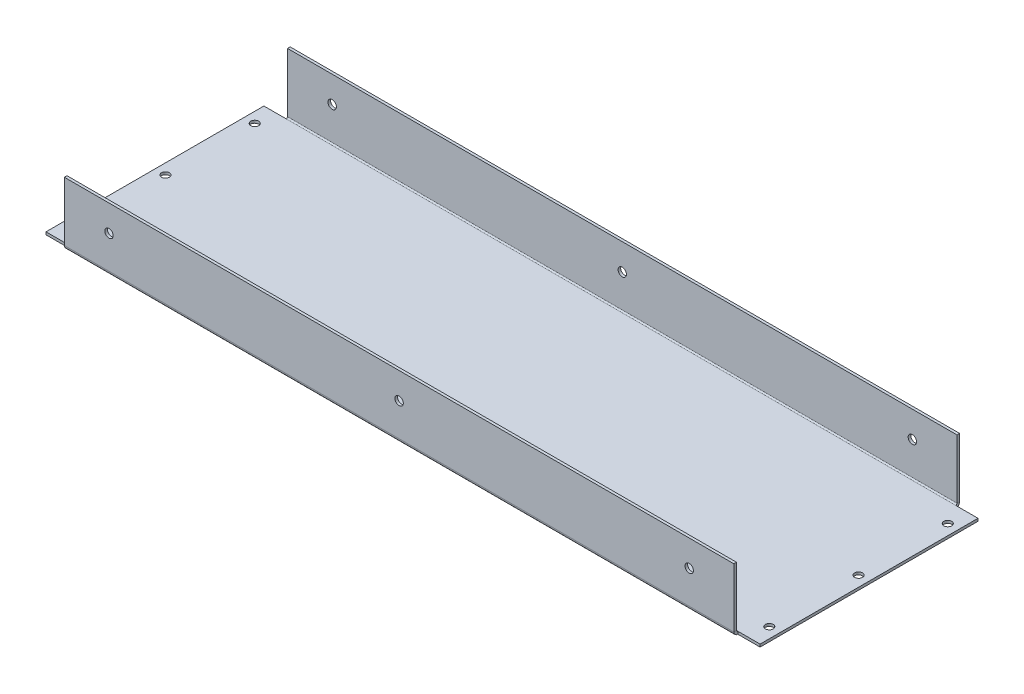
ISO-10303-21;
HEADER;
FILE_DESCRIPTION(('STEP AP214'),'2;1');
FILE_NAME('part.step','',(''),(''),'','','');
FILE_SCHEMA(('AUTOMOTIVE_DESIGN { 1 0 10303 214 1 1 1 1 }'));
ENDSEC;
DATA;
#1=APPLICATION_CONTEXT('core data for automotive mechanical design processes');
#2=APPLICATION_PROTOCOL_DEFINITION('international standard','automotive_design',2000,#1);
#3=PRODUCT_CONTEXT('',#1,'mechanical');
#4=PRODUCT('Part','Part','',(#3));
#5=PRODUCT_RELATED_PRODUCT_CATEGORY('part','',(#4));
#6=PRODUCT_DEFINITION_FORMATION('','',#4);
#7=PRODUCT_DEFINITION_CONTEXT('part definition',#1,'design');
#8=PRODUCT_DEFINITION('design','',#6,#7);
#9=PRODUCT_DEFINITION_SHAPE('','',#8);
#10=(LENGTH_UNIT() NAMED_UNIT(*) SI_UNIT(.MILLI.,.METRE.));
#11=(NAMED_UNIT(*) PLANE_ANGLE_UNIT() SI_UNIT($,.RADIAN.));
#12=(NAMED_UNIT(*) SI_UNIT($,.STERADIAN.) SOLID_ANGLE_UNIT());
#13=UNCERTAINTY_MEASURE_WITH_UNIT(LENGTH_MEASURE(1.E-05),#10,'distance_accuracy_value','');
#14=(GEOMETRIC_REPRESENTATION_CONTEXT(3) GLOBAL_UNCERTAINTY_ASSIGNED_CONTEXT((#13)) GLOBAL_UNIT_ASSIGNED_CONTEXT((#10,
#11,#12)) REPRESENTATION_CONTEXT('',''));
#15=CARTESIAN_POINT('',(0.,0.,0.));
#16=DIRECTION('',(0.,0.,1.));
#17=DIRECTION('',(1.,0.,0.));
#18=AXIS2_PLACEMENT_3D('',#15,#16,#17);
#19=CARTESIAN_POINT('',(193.572452229299,0.5,43.3009554140127));
#20=DIRECTION('',(1.,0.,0.));
#21=DIRECTION('',(0.,0.,1.));
#22=AXIS2_PLACEMENT_3D('',#19,#20,#21);
#23=CYLINDRICAL_SURFACE('',#22,1.5);
#24=DIRECTION('',(-1.,0.,0.));
#25=VECTOR('',#24,1.);
#26=CARTESIAN_POINT('',(0.,0.5,44.8009554140127));
#27=LINE('',#26,#25);
#28=CARTESIAN_POINT('',(185.072452229299,0.500000000000014,44.8009554140127));
#29=VERTEX_POINT('',#28);
#30=CARTESIAN_POINT('',(-69.9275477707006,0.5,44.8009554140127));
#31=VERTEX_POINT('',#30);
#32=EDGE_CURVE('E200',#29,#31,#27,.T.);
#33=ORIENTED_EDGE('',*,*,#32,.T.);
#34=CARTESIAN_POINT('',(-69.9275477707006,0.5,43.3009554140127));
#35=DIRECTION('',(1.,0.,0.));
#36=DIRECTION('',(0.,0.,-1.));
#37=AXIS2_PLACEMENT_3D('',#34,#35,#36);
#38=CIRCLE('',#37,1.5);
#39=CARTESIAN_POINT('',(-69.9275477707006,-1.,43.3009554140127));
#40=VERTEX_POINT('',#39);
#41=EDGE_CURVE('E178',#40,#31,#38,.F.);
#42=ORIENTED_EDGE('',*,*,#41,.F.);
#43=DIRECTION('',(1.,0.,0.));
#44=VECTOR('',#43,1.);
#45=CARTESIAN_POINT('',(193.572452229299,-1.,43.3009554140127));
#46=LINE('',#45,#44);
#47=CARTESIAN_POINT('',(185.072452229299,-1.,43.3009554140127));
#48=VERTEX_POINT('',#47);
#49=EDGE_CURVE('E224',#48,#40,#46,.F.);
#50=ORIENTED_EDGE('',*,*,#49,.F.);
#51=CARTESIAN_POINT('',(185.072452229299,0.5,43.3009554140127));
#52=DIRECTION('',(-1.,0.,0.));
#53=DIRECTION('',(0.,0.,1.));
#54=AXIS2_PLACEMENT_3D('',#51,#52,#53);
#55=CIRCLE('',#54,1.5);
#56=EDGE_CURVE('E207',#48,#29,#55,.T.);
#57=ORIENTED_EDGE('',*,*,#56,.T.);
#58=EDGE_LOOP('',(#33,#42,#50,#57));
#59=FACE_BOUND('',#58,.T.);
#60=ADVANCED_FACE('F61',(#59),#23,.T.);
#61=CARTESIAN_POINT('',(193.572452229299,0.5,43.3009554140127));
#62=DIRECTION('',(1.,0.,0.));
#63=DIRECTION('',(0.,0.,1.));
#64=AXIS2_PLACEMENT_3D('',#61,#62,#63);
#65=CYLINDRICAL_SURFACE('',#64,0.5);
#66=CARTESIAN_POINT('',(-69.9275477707006,0.5,43.3009554140127));
#67=DIRECTION('',(1.,0.,0.));
#68=DIRECTION('',(0.,0.,-1.));
#69=AXIS2_PLACEMENT_3D('',#66,#67,#68);
#70=CIRCLE('',#69,0.5);
#71=CARTESIAN_POINT('',(-69.9275477707006,3.04907392053331E-13,43.3009554140127));
#72=VERTEX_POINT('',#71);
#73=CARTESIAN_POINT('',(-69.9275477707006,0.500000000000004,43.8009554140127));
#74=VERTEX_POINT('',#73);
#75=EDGE_CURVE('E188',#72,#74,#70,.F.);
#76=ORIENTED_EDGE('',*,*,#75,.T.);
#77=DIRECTION('',(1.,0.,0.));
#78=VECTOR('',#77,1.);
#79=CARTESIAN_POINT('',(-78.4275477707006,0.5,43.8009554140127));
#80=LINE('',#79,#78);
#81=CARTESIAN_POINT('',(185.072452229299,0.5,43.8009554140127));
#82=VERTEX_POINT('',#81);
#83=EDGE_CURVE('E209',#74,#82,#80,.T.);
#84=ORIENTED_EDGE('',*,*,#83,.T.);
#85=CARTESIAN_POINT('',(185.072452229299,0.5,43.3009554140127));
#86=DIRECTION('',(-1.,0.,0.));
#87=DIRECTION('',(0.,0.,1.));
#88=AXIS2_PLACEMENT_3D('',#85,#86,#87);
#89=CIRCLE('',#88,0.5);
#90=CARTESIAN_POINT('',(185.072452229299,0.,43.3009554140127));
#91=VERTEX_POINT('',#90);
#92=EDGE_CURVE('E327',#91,#82,#89,.T.);
#93=ORIENTED_EDGE('',*,*,#92,.F.);
#94=DIRECTION('',(1.,0.,0.));
#95=VECTOR('',#94,1.);
#96=CARTESIAN_POINT('',(193.572452229299,0.,43.3009554140127));
#97=LINE('',#96,#95);
#98=EDGE_CURVE('E218',#91,#72,#97,.F.);
#99=ORIENTED_EDGE('',*,*,#98,.T.);
#100=EDGE_LOOP('',(#76,#84,#93,#99));
#101=FACE_BOUND('',#100,.T.);
#102=ADVANCED_FACE('F413',(#101),#65,.F.);
#103=CARTESIAN_POINT('',(0.,0.,44.8009554140127));
#104=DIRECTION('',(0.,0.,-1.));
#105=DIRECTION('',(-1.,0.,0.));
#106=AXIS2_PLACEMENT_3D('',#103,#104,#105);
#107=PLANE('',#106);
#108=CARTESIAN_POINT('',(168.072452229299,13.0000000000003,44.8009554140127));
#109=DIRECTION('',(0.,0.,-1.));
#110=DIRECTION('',(-1.,0.,0.));
#111=AXIS2_PLACEMENT_3D('',#108,#109,#110);
#112=CIRCLE('',#111,1.59999999999999);
#113=CARTESIAN_POINT('',(166.472452229299,13.0000000000003,44.8009554140127));
#114=VERTEX_POINT('',#113);
#115=EDGE_CURVE('E266',#114,#114,#112,.T.);
#116=ORIENTED_EDGE('',*,*,#115,.T.);
#117=EDGE_LOOP('',(#116));
#118=FACE_BOUND('',#117,.T.);
#119=CARTESIAN_POINT('',(57.5724522292993,13.0000000000003,44.8009554140127));
#120=DIRECTION('',(0.,0.,-1.));
#121=DIRECTION('',(-1.,0.,0.));
#122=AXIS2_PLACEMENT_3D('',#119,#120,#121);
#123=CIRCLE('',#122,1.59999999999999);
#124=CARTESIAN_POINT('',(55.9724522292993,13.0000000000003,44.8009554140127));
#125=VERTEX_POINT('',#124);
#126=EDGE_CURVE('E251',#125,#125,#123,.T.);
#127=ORIENTED_EDGE('',*,*,#126,.T.);
#128=EDGE_LOOP('',(#127));
#129=FACE_BOUND('',#128,.T.);
#130=CARTESIAN_POINT('',(-52.9275477707007,13.0000000000003,44.8009554140127));
#131=DIRECTION('',(0.,0.,-1.));
#132=DIRECTION('',(-1.,0.,0.));
#133=AXIS2_PLACEMENT_3D('',#130,#131,#132);
#134=CIRCLE('',#133,1.6);
#135=CARTESIAN_POINT('',(-54.5275477707007,13.0000000000003,44.8009554140127));
#136=VERTEX_POINT('',#135);
#137=EDGE_CURVE('E247',#136,#136,#134,.T.);
#138=ORIENTED_EDGE('',*,*,#137,.T.);
#139=EDGE_LOOP('',(#138));
#140=FACE_BOUND('',#139,.T.);
#141=DIRECTION('',(0.,-1.,0.));
#142=VECTOR('',#141,1.);
#143=CARTESIAN_POINT('',(-69.9275477707006,0.,44.8009554140127));
#144=LINE('',#143,#142);
#145=CARTESIAN_POINT('',(-69.9275477707006,23.,44.8009554140127));
#146=VERTEX_POINT('',#145);
#147=EDGE_CURVE('E78',#146,#31,#144,.T.);
#148=ORIENTED_EDGE('',*,*,#147,.T.);
#149=ORIENTED_EDGE('',*,*,#32,.F.);
#150=DIRECTION('',(0.,1.,0.));
#151=VECTOR('',#150,1.);
#152=CARTESIAN_POINT('',(185.072452229299,11.75,44.8009554140127));
#153=LINE('',#152,#151);
#154=CARTESIAN_POINT('',(185.072452229299,23.,44.8009554140127));
#155=VERTEX_POINT('',#154);
#156=EDGE_CURVE('E312',#155,#29,#153,.F.);
#157=ORIENTED_EDGE('',*,*,#156,.F.);
#158=DIRECTION('',(-1.,0.,0.));
#159=VECTOR('',#158,1.);
#160=CARTESIAN_POINT('',(-78.4275477707006,23.,44.8009554140127));
#161=LINE('',#160,#159);
#162=EDGE_CURVE('E202',#155,#146,#161,.T.);
#163=ORIENTED_EDGE('',*,*,#162,.T.);
#164=EDGE_LOOP('',(#148,#149,#157,#163));
#165=FACE_BOUND('',#164,.T.);
#166=ADVANCED_FACE('F198',(#118,#129,#140,#165),#107,.F.);
#167=CARTESIAN_POINT('',(0.,0.,43.8009554140127));
#168=DIRECTION('',(0.,0.,-1.));
#169=DIRECTION('',(-1.,0.,0.));
#170=AXIS2_PLACEMENT_3D('',#167,#168,#169);
#171=PLANE('',#170);
#172=CARTESIAN_POINT('',(168.072452229299,13.0000000000003,43.8009554140127));
#173=DIRECTION('',(0.,0.,-1.));
#174=DIRECTION('',(-1.,0.,0.));
#175=AXIS2_PLACEMENT_3D('',#172,#173,#174);
#176=CIRCLE('',#175,1.59999999999999);
#177=CARTESIAN_POINT('',(166.472452229299,13.0000000000003,43.8009554140127));
#178=VERTEX_POINT('',#177);
#179=EDGE_CURVE('E263',#178,#178,#176,.T.);
#180=ORIENTED_EDGE('',*,*,#179,.F.);
#181=EDGE_LOOP('',(#180));
#182=FACE_BOUND('',#181,.T.);
#183=CARTESIAN_POINT('',(57.5724522292993,13.0000000000003,43.8009554140127));
#184=DIRECTION('',(0.,0.,-1.));
#185=DIRECTION('',(-1.,0.,0.));
#186=AXIS2_PLACEMENT_3D('',#183,#184,#185);
#187=CIRCLE('',#186,1.59999999999999);
#188=CARTESIAN_POINT('',(55.9724522292993,13.0000000000003,43.8009554140127));
#189=VERTEX_POINT('',#188);
#190=EDGE_CURVE('E246',#189,#189,#187,.T.);
#191=ORIENTED_EDGE('',*,*,#190,.F.);
#192=EDGE_LOOP('',(#191));
#193=FACE_BOUND('',#192,.T.);
#194=CARTESIAN_POINT('',(-52.9275477707007,13.0000000000003,43.8009554140127));
#195=DIRECTION('',(0.,0.,-1.));
#196=DIRECTION('',(-1.,0.,0.));
#197=AXIS2_PLACEMENT_3D('',#194,#195,#196);
#198=CIRCLE('',#197,1.6);
#199=CARTESIAN_POINT('',(-54.5275477707007,13.0000000000003,43.8009554140127));
#200=VERTEX_POINT('',#199);
#201=EDGE_CURVE('E242',#200,#200,#198,.T.);
#202=ORIENTED_EDGE('',*,*,#201,.F.);
#203=EDGE_LOOP('',(#202));
#204=FACE_BOUND('',#203,.T.);
#205=ORIENTED_EDGE('',*,*,#83,.F.);
#206=DIRECTION('',(0.,1.,0.));
#207=VECTOR('',#206,1.);
#208=CARTESIAN_POINT('',(-69.9275477707006,11.75,43.8009554140127));
#209=LINE('',#208,#207);
#210=CARTESIAN_POINT('',(-69.9275477707006,23.,43.8009554140127));
#211=VERTEX_POINT('',#210);
#212=EDGE_CURVE('E192',#211,#74,#209,.F.);
#213=ORIENTED_EDGE('',*,*,#212,.F.);
#214=DIRECTION('',(-1.,0.,0.));
#215=VECTOR('',#214,1.);
#216=CARTESIAN_POINT('',(-78.4275477707006,23.,43.8009554140127));
#217=LINE('',#216,#215);
#218=CARTESIAN_POINT('',(185.072452229299,23.,43.8009554140127));
#219=VERTEX_POINT('',#218);
#220=EDGE_CURVE('E208',#219,#211,#217,.T.);
#221=ORIENTED_EDGE('',*,*,#220,.F.);
#222=DIRECTION('',(0.,-1.,0.));
#223=VECTOR('',#222,1.);
#224=CARTESIAN_POINT('',(185.072452229299,0.,43.8009554140127));
#225=LINE('',#224,#223);
#226=EDGE_CURVE('E86',#219,#82,#225,.T.);
#227=ORIENTED_EDGE('',*,*,#226,.T.);
#228=EDGE_LOOP('',(#205,#213,#221,#227));
#229=FACE_BOUND('',#228,.T.);
#230=ADVANCED_FACE('F419',(#182,#193,#204,#229),#171,.T.);
#231=CARTESIAN_POINT('',(-78.4275477707006,23.,44.8009554140127));
#232=DIRECTION('',(0.,-1.,0.));
#233=DIRECTION('',(0.,0.,-1.));
#234=AXIS2_PLACEMENT_3D('',#231,#232,#233);
#235=PLANE('',#234);
#236=DIRECTION('',(0.,0.,-1.));
#237=VECTOR('',#236,1.);
#238=CARTESIAN_POINT('',(-69.9275477707006,23.,44.8009554140127));
#239=LINE('',#238,#237);
#240=EDGE_CURVE('E203',#211,#146,#239,.F.);
#241=ORIENTED_EDGE('',*,*,#240,.T.);
#242=ORIENTED_EDGE('',*,*,#162,.F.);
#243=DIRECTION('',(0.,0.,1.));
#244=VECTOR('',#243,1.);
#245=CARTESIAN_POINT('',(185.072452229299,23.,43.8009554140127));
#246=LINE('',#245,#244);
#247=EDGE_CURVE('E311',#155,#219,#246,.F.);
#248=ORIENTED_EDGE('',*,*,#247,.T.);
#249=ORIENTED_EDGE('',*,*,#220,.T.);
#250=EDGE_LOOP('',(#241,#242,#248,#249));
#251=FACE_BOUND('',#250,.T.);
#252=ADVANCED_FACE('F421',(#251),#235,.F.);
#253=CARTESIAN_POINT('',(-78.4275477707007,0.499999999999994,-39.6990445859873));
#254=DIRECTION('',(-1.,0.,0.));
#255=DIRECTION('',(0.,0.,-1.));
#256=AXIS2_PLACEMENT_3D('',#253,#254,#255);
#257=CYLINDRICAL_SURFACE('',#256,1.5);
#258=DIRECTION('',(1.,0.,0.));
#259=VECTOR('',#258,1.);
#260=CARTESIAN_POINT('',(0.,0.500000000000002,-41.1990445859873));
#261=LINE('',#260,#259);
#262=CARTESIAN_POINT('',(-69.9275477707006,0.500000000000007,-41.1990445859873));
#263=VERTEX_POINT('',#262);
#264=CARTESIAN_POINT('',(185.072452229299,0.5,-41.1990445859873));
#265=VERTEX_POINT('',#264);
#266=EDGE_CURVE('E336',#263,#265,#261,.T.);
#267=ORIENTED_EDGE('',*,*,#266,.T.);
#268=CARTESIAN_POINT('',(185.072452229299,0.499999999999993,-39.6990445859873));
#269=DIRECTION('',(-1.,0.,0.));
#270=DIRECTION('',(0.,0.,1.));
#271=AXIS2_PLACEMENT_3D('',#268,#269,#270);
#272=CIRCLE('',#271,1.5);
#273=CARTESIAN_POINT('',(185.072452229299,-1.00000000000001,-39.6990445859873));
#274=VERTEX_POINT('',#273);
#275=EDGE_CURVE('E292',#265,#274,#272,.T.);
#276=ORIENTED_EDGE('',*,*,#275,.T.);
#277=DIRECTION('',(-1.,0.,0.));
#278=VECTOR('',#277,1.);
#279=CARTESIAN_POINT('',(-78.4275477707007,-1.00000000000001,-39.6990445859873));
#280=LINE('',#279,#278);
#281=CARTESIAN_POINT('',(-69.9275477707006,-1.00000000000001,-39.6990445859873));
#282=VERTEX_POINT('',#281);
#283=EDGE_CURVE('E350',#282,#274,#280,.F.);
#284=ORIENTED_EDGE('',*,*,#283,.F.);
#285=CARTESIAN_POINT('',(-69.9275477707007,0.499999999999993,-39.6990445859873));
#286=DIRECTION('',(1.,0.,0.));
#287=DIRECTION('',(0.,0.,-1.));
#288=AXIS2_PLACEMENT_3D('',#285,#286,#287);
#289=CIRCLE('',#288,1.5);
#290=EDGE_CURVE('E315',#282,#263,#289,.T.);
#291=ORIENTED_EDGE('',*,*,#290,.T.);
#292=EDGE_LOOP('',(#267,#276,#284,#291));
#293=FACE_BOUND('',#292,.T.);
#294=ADVANCED_FACE('F399',(#293),#257,.T.);
#295=CARTESIAN_POINT('',(-78.4275477707007,0.499999999999994,-39.6990445859873));
#296=DIRECTION('',(-1.,0.,0.));
#297=DIRECTION('',(0.,0.,-1.));
#298=AXIS2_PLACEMENT_3D('',#295,#296,#297);
#299=CYLINDRICAL_SURFACE('',#298,0.5);
#300=CARTESIAN_POINT('',(185.072452229299,0.499999999999993,-39.6990445859873));
#301=DIRECTION('',(1.,0.,0.));
#302=DIRECTION('',(0.,0.,-1.));
#303=AXIS2_PLACEMENT_3D('',#300,#301,#302);
#304=CIRCLE('',#303,0.5);
#305=CARTESIAN_POINT('',(185.072452229299,0.5,-40.1990445859873));
#306=VERTEX_POINT('',#305);
#307=CARTESIAN_POINT('',(185.072452229299,0.,-39.6990445859873));
#308=VERTEX_POINT('',#307);
#309=EDGE_CURVE('E305',#306,#308,#304,.F.);
#310=ORIENTED_EDGE('',*,*,#309,.F.);
#311=DIRECTION('',(-1.,0.,0.));
#312=VECTOR('',#311,1.);
#313=CARTESIAN_POINT('',(193.572452229299,0.5,-40.1990445859873));
#314=LINE('',#313,#312);
#315=CARTESIAN_POINT('',(-69.9275477707006,0.500000000000004,-40.1990445859873));
#316=VERTEX_POINT('',#315);
#317=EDGE_CURVE('E333',#306,#316,#314,.T.);
#318=ORIENTED_EDGE('',*,*,#317,.T.);
#319=CARTESIAN_POINT('',(-69.9275477707007,0.499999999999993,-39.6990445859873));
#320=DIRECTION('',(1.,0.,0.));
#321=DIRECTION('',(0.,0.,-1.));
#322=AXIS2_PLACEMENT_3D('',#319,#320,#321);
#323=CIRCLE('',#322,0.5);
#324=CARTESIAN_POINT('',(-69.9275477707006,0.,-39.6990445859873));
#325=VERTEX_POINT('',#324);
#326=EDGE_CURVE('E319',#325,#316,#323,.T.);
#327=ORIENTED_EDGE('',*,*,#326,.F.);
#328=DIRECTION('',(-1.,0.,0.));
#329=VECTOR('',#328,1.);
#330=CARTESIAN_POINT('',(-78.4275477707007,0.,-39.6990445859873));
#331=LINE('',#330,#329);
#332=EDGE_CURVE('E343',#325,#308,#331,.F.);
#333=ORIENTED_EDGE('',*,*,#332,.T.);
#334=EDGE_LOOP('',(#310,#318,#327,#333));
#335=FACE_BOUND('',#334,.T.);
#336=ADVANCED_FACE('F379',(#335),#299,.F.);
#337=CARTESIAN_POINT('',(0.,-1.49023779819157E-13,-41.1990445859873));
#338=DIRECTION('',(0.,0.,1.));
#339=DIRECTION('',(0.,-1.,0.));
#340=AXIS2_PLACEMENT_3D('',#337,#338,#339);
#341=PLANE('',#340);
#342=CARTESIAN_POINT('',(168.072452229299,13.,-41.1990445859873));
#343=DIRECTION('',(0.,0.,-1.));
#344=DIRECTION('',(0.,1.,0.));
#345=AXIS2_PLACEMENT_3D('',#342,#343,#344);
#346=CIRCLE('',#345,1.59999999999999);
#347=CARTESIAN_POINT('',(168.072452229299,14.6,-41.1990445859873));
#348=VERTEX_POINT('',#347);
#349=EDGE_CURVE('E243',#348,#348,#346,.T.);
#350=ORIENTED_EDGE('',*,*,#349,.F.);
#351=EDGE_LOOP('',(#350));
#352=FACE_BOUND('',#351,.T.);
#353=CARTESIAN_POINT('',(57.5724522292993,13.,-41.1990445859873));
#354=DIRECTION('',(0.,0.,-1.));
#355=DIRECTION('',(0.,1.,0.));
#356=AXIS2_PLACEMENT_3D('',#353,#354,#355);
#357=CIRCLE('',#356,1.59999999999999);
#358=CARTESIAN_POINT('',(57.5724522292993,14.6,-41.1990445859873));
#359=VERTEX_POINT('',#358);
#360=EDGE_CURVE('E833',#359,#359,#357,.T.);
#361=ORIENTED_EDGE('',*,*,#360,.F.);
#362=EDGE_LOOP('',(#361));
#363=FACE_BOUND('',#362,.T.);
#364=CARTESIAN_POINT('',(-52.9275477707007,13.,-41.1990445859873));
#365=DIRECTION('',(0.,0.,-1.));
#366=DIRECTION('',(0.,1.,0.));
#367=AXIS2_PLACEMENT_3D('',#364,#365,#366);
#368=CIRCLE('',#367,1.6);
#369=CARTESIAN_POINT('',(-52.9275477707007,14.6,-41.1990445859873));
#370=VERTEX_POINT('',#369);
#371=EDGE_CURVE('E830',#370,#370,#368,.T.);
#372=ORIENTED_EDGE('',*,*,#371,.F.);
#373=EDGE_LOOP('',(#372));
#374=FACE_BOUND('',#373,.T.);
#375=DIRECTION('',(0.,1.,0.));
#376=VECTOR('',#375,1.);
#377=CARTESIAN_POINT('',(185.072452229299,11.75,-41.1990445859873));
#378=LINE('',#377,#376);
#379=CARTESIAN_POINT('',(185.072452229299,23.,-41.1990445859873));
#380=VERTEX_POINT('',#379);
#381=EDGE_CURVE('E193',#265,#380,#378,.T.);
#382=ORIENTED_EDGE('',*,*,#381,.F.);
#383=ORIENTED_EDGE('',*,*,#266,.F.);
#384=DIRECTION('',(0.,1.,0.));
#385=VECTOR('',#384,1.);
#386=CARTESIAN_POINT('',(-69.9275477707006,11.75,-41.1990445859873));
#387=LINE('',#386,#385);
#388=CARTESIAN_POINT('',(-69.9275477707006,23.,-41.1990445859873));
#389=VERTEX_POINT('',#388);
#390=EDGE_CURVE('E289',#389,#263,#387,.F.);
#391=ORIENTED_EDGE('',*,*,#390,.F.);
#392=DIRECTION('',(1.,0.,0.));
#393=VECTOR('',#392,1.);
#394=CARTESIAN_POINT('',(193.572452229299,23.,-41.1990445859873));
#395=LINE('',#394,#393);
#396=EDGE_CURVE('E340',#389,#380,#395,.T.);
#397=ORIENTED_EDGE('',*,*,#396,.T.);
#398=EDGE_LOOP('',(#382,#383,#391,#397));
#399=FACE_BOUND('',#398,.T.);
#400=ADVANCED_FACE('F395',(#352,#363,#374,#399),#341,.F.);
#401=CARTESIAN_POINT('',(0.,-1.45532298480314E-13,-40.1990445859873));
#402=DIRECTION('',(0.,0.,1.));
#403=DIRECTION('',(0.,-1.,0.));
#404=AXIS2_PLACEMENT_3D('',#401,#402,#403);
#405=PLANE('',#404);
#406=CARTESIAN_POINT('',(168.072452229299,13.,-40.1990445859873));
#407=DIRECTION('',(0.,0.,1.));
#408=DIRECTION('',(0.,-1.,0.));
#409=AXIS2_PLACEMENT_3D('',#406,#407,#408);
#410=CIRCLE('',#409,1.59999999999999);
#411=CARTESIAN_POINT('',(168.072452229299,11.4,-40.1990445859873));
#412=VERTEX_POINT('',#411);
#413=EDGE_CURVE('E65',#412,#412,#410,.T.);
#414=ORIENTED_EDGE('',*,*,#413,.F.);
#415=EDGE_LOOP('',(#414));
#416=FACE_BOUND('',#415,.T.);
#417=CARTESIAN_POINT('',(57.5724522292993,13.,-40.1990445859873));
#418=DIRECTION('',(0.,0.,1.));
#419=DIRECTION('',(0.,-1.,0.));
#420=AXIS2_PLACEMENT_3D('',#417,#418,#419);
#421=CIRCLE('',#420,1.59999999999999);
#422=CARTESIAN_POINT('',(57.5724522292993,11.4,-40.1990445859873));
#423=VERTEX_POINT('',#422);
#424=EDGE_CURVE('E244',#423,#423,#421,.T.);
#425=ORIENTED_EDGE('',*,*,#424,.F.);
#426=EDGE_LOOP('',(#425));
#427=FACE_BOUND('',#426,.T.);
#428=CARTESIAN_POINT('',(-52.9275477707007,13.,-40.1990445859873));
#429=DIRECTION('',(0.,0.,1.));
#430=DIRECTION('',(0.,-1.,0.));
#431=AXIS2_PLACEMENT_3D('',#428,#429,#430);
#432=CIRCLE('',#431,1.6);
#433=CARTESIAN_POINT('',(-52.9275477707007,11.4,-40.1990445859873));
#434=VERTEX_POINT('',#433);
#435=EDGE_CURVE('E240',#434,#434,#432,.T.);
#436=ORIENTED_EDGE('',*,*,#435,.F.);
#437=EDGE_LOOP('',(#436));
#438=FACE_BOUND('',#437,.T.);
#439=ORIENTED_EDGE('',*,*,#317,.F.);
#440=DIRECTION('',(0.,1.,0.));
#441=VECTOR('',#440,1.);
#442=CARTESIAN_POINT('',(185.072452229299,23.,-40.1990445859873));
#443=LINE('',#442,#441);
#444=CARTESIAN_POINT('',(185.072452229299,23.,-40.1990445859873));
#445=VERTEX_POINT('',#444);
#446=EDGE_CURVE('E272',#306,#445,#443,.T.);
#447=ORIENTED_EDGE('',*,*,#446,.T.);
#448=DIRECTION('',(1.,0.,0.));
#449=VECTOR('',#448,1.);
#450=CARTESIAN_POINT('',(193.572452229299,23.,-40.1990445859873));
#451=LINE('',#450,#449);
#452=CARTESIAN_POINT('',(-69.9275477707006,23.,-40.1990445859873));
#453=VERTEX_POINT('',#452);
#454=EDGE_CURVE('E339',#453,#445,#451,.T.);
#455=ORIENTED_EDGE('',*,*,#454,.F.);
#456=DIRECTION('',(0.,-1.,0.));
#457=VECTOR('',#456,1.);
#458=CARTESIAN_POINT('',(-69.9275477707006,23.,-40.1990445859873));
#459=LINE('',#458,#457);
#460=EDGE_CURVE('E285',#453,#316,#459,.T.);
#461=ORIENTED_EDGE('',*,*,#460,.T.);
#462=EDGE_LOOP('',(#439,#447,#455,#461));
#463=FACE_BOUND('',#462,.T.);
#464=ADVANCED_FACE('F385',(#416,#427,#438,#463),#405,.T.);
#465=CARTESIAN_POINT('',(193.572452229299,23.,-41.1990445859873));
#466=DIRECTION('',(0.,-1.,0.));
#467=DIRECTION('',(0.,0.,-1.));
#468=AXIS2_PLACEMENT_3D('',#465,#466,#467);
#469=PLANE('',#468);
#470=DIRECTION('',(0.,0.,-1.));
#471=VECTOR('',#470,1.);
#472=CARTESIAN_POINT('',(185.072452229299,23.,-40.1990445859873));
#473=LINE('',#472,#471);
#474=EDGE_CURVE('E275',#380,#445,#473,.F.);
#475=ORIENTED_EDGE('',*,*,#474,.F.);
#476=ORIENTED_EDGE('',*,*,#396,.F.);
#477=DIRECTION('',(0.,0.,-1.));
#478=VECTOR('',#477,1.);
#479=CARTESIAN_POINT('',(-69.9275477707006,23.,-40.1990445859873));
#480=LINE('',#479,#478);
#481=EDGE_CURVE('E288',#389,#453,#480,.F.);
#482=ORIENTED_EDGE('',*,*,#481,.T.);
#483=ORIENTED_EDGE('',*,*,#454,.T.);
#484=EDGE_LOOP('',(#475,#476,#482,#483));
#485=FACE_BOUND('',#484,.T.);
#486=ADVANCED_FACE('F392',(#485),#469,.F.);
#487=CARTESIAN_POINT('',(0.,-1.,0.));
#488=DIRECTION('',(0.,-1.,0.));
#489=DIRECTION('',(0.,0.,-1.));
#490=AXIS2_PLACEMENT_3D('',#487,#488,#489);
#491=PLANE('',#490);
#492=CARTESIAN_POINT('',(-74.4275477707009,-1.,-32.1990445859873));
#493=DIRECTION('',(0.,-1.,0.));
#494=DIRECTION('',(0.,0.,-1.));
#495=AXIS2_PLACEMENT_3D('',#492,#493,#494);
#496=CIRCLE('',#495,1.5);
#497=CARTESIAN_POINT('',(-74.4275477707009,-1.,-33.6990445859873));
#498=VERTEX_POINT('',#497);
#499=EDGE_CURVE('E794',#498,#498,#496,.T.);
#500=ORIENTED_EDGE('',*,*,#499,.F.);
#501=EDGE_LOOP('',(#500));
#502=FACE_BOUND('',#501,.T.);
#503=CARTESIAN_POINT('',(-74.4275477707004,-1.,35.8009554140127));
#504=DIRECTION('',(0.,-1.,0.));
#505=DIRECTION('',(0.,0.,-1.));
#506=AXIS2_PLACEMENT_3D('',#503,#504,#505);
#507=CIRCLE('',#506,1.49999999999985);
#508=CARTESIAN_POINT('',(-74.4275477707004,-1.,34.3009554140129));
#509=VERTEX_POINT('',#508);
#510=EDGE_CURVE('E826',#509,#509,#507,.T.);
#511=ORIENTED_EDGE('',*,*,#510,.F.);
#512=EDGE_LOOP('',(#511));
#513=FACE_BOUND('',#512,.T.);
#514=CARTESIAN_POINT('',(189.572452229299,-1.,1.80095541401274));
#515=DIRECTION('',(0.,-1.,0.));
#516=DIRECTION('',(0.,0.,-1.));
#517=AXIS2_PLACEMENT_3D('',#514,#515,#516);
#518=CIRCLE('',#517,1.49999999999985);
#519=CARTESIAN_POINT('',(189.572452229299,-1.,0.300955414012888));
#520=VERTEX_POINT('',#519);
#521=EDGE_CURVE('E823',#520,#520,#518,.T.);
#522=ORIENTED_EDGE('',*,*,#521,.F.);
#523=EDGE_LOOP('',(#522));
#524=FACE_BOUND('',#523,.T.);
#525=CARTESIAN_POINT('',(189.572452229299,-1.,-32.1990445859873));
#526=DIRECTION('',(0.,-1.,0.));
#527=DIRECTION('',(0.,0.,-1.));
#528=AXIS2_PLACEMENT_3D('',#525,#526,#527);
#529=CIRCLE('',#528,1.50000000000003);
#530=CARTESIAN_POINT('',(189.572452229299,-1.,-33.6990445859873));
#531=VERTEX_POINT('',#530);
#532=EDGE_CURVE('E820',#531,#531,#529,.T.);
#533=ORIENTED_EDGE('',*,*,#532,.F.);
#534=EDGE_LOOP('',(#533));
#535=FACE_BOUND('',#534,.T.);
#536=CARTESIAN_POINT('',(189.5724522293,-1.,35.8009554140127));
#537=DIRECTION('',(0.,-1.,0.));
#538=DIRECTION('',(0.,0.,-1.));
#539=AXIS2_PLACEMENT_3D('',#536,#537,#538);
#540=CIRCLE('',#539,1.49999999999982);
#541=CARTESIAN_POINT('',(189.5724522293,-1.,34.3009554140129));
#542=VERTEX_POINT('',#541);
#543=EDGE_CURVE('E817',#542,#542,#540,.T.);
#544=ORIENTED_EDGE('',*,*,#543,.F.);
#545=EDGE_LOOP('',(#544));
#546=FACE_BOUND('',#545,.T.);
#547=CARTESIAN_POINT('',(-74.4275477707008,-1.,1.80095541401274));
#548=DIRECTION('',(0.,-1.,0.));
#549=DIRECTION('',(0.,0.,-1.));
#550=AXIS2_PLACEMENT_3D('',#547,#548,#549);
#551=CIRCLE('',#550,1.50000000000013);
#552=CARTESIAN_POINT('',(-74.4275477707008,-1.,0.300955414012612));
#553=VERTEX_POINT('',#552);
#554=EDGE_CURVE('E802',#553,#553,#551,.T.);
#555=ORIENTED_EDGE('',*,*,#554,.F.);
#556=EDGE_LOOP('',(#555));
#557=FACE_BOUND('',#556,.T.);
#558=DIRECTION('',(0.,0.,1.));
#559=VECTOR('',#558,1.);
#560=CARTESIAN_POINT('',(-78.4275477707006,-1.,43.8009554140127));
#561=LINE('',#560,#559);
#562=CARTESIAN_POINT('',(-78.4275477707006,-1.00000000000001,-39.6990445859873));
#563=VERTEX_POINT('',#562);
#564=CARTESIAN_POINT('',(-78.4275477707007,-1.,43.3009554140127));
#565=VERTEX_POINT('',#564);
#566=EDGE_CURVE('E70',#563,#565,#561,.T.);
#567=ORIENTED_EDGE('',*,*,#566,.F.);
#568=EDGE_CURVE('E346',#563,#282,#280,.F.);
#569=ORIENTED_EDGE('',*,*,#568,.T.);
#570=ORIENTED_EDGE('',*,*,#283,.T.);
#571=DIRECTION('',(-1.,0.,0.));
#572=VECTOR('',#571,1.);
#573=CARTESIAN_POINT('',(-78.4275477707007,-1.00000000000001,-39.6990445859873));
#574=LINE('',#573,#572);
#575=CARTESIAN_POINT('',(193.572452229299,-1.00000000000001,-39.6990445859873));
#576=VERTEX_POINT('',#575);
#577=EDGE_CURVE('E299',#274,#576,#574,.F.);
#578=ORIENTED_EDGE('',*,*,#577,.T.);
#579=DIRECTION('',(0.,0.,-1.));
#580=VECTOR('',#579,1.);
#581=CARTESIAN_POINT('',(193.572452229299,-1.,43.8009554140127));
#582=LINE('',#581,#580);
#583=CARTESIAN_POINT('',(193.572452229299,-1.,43.3009554140127));
#584=VERTEX_POINT('',#583);
#585=EDGE_CURVE('E12',#584,#576,#582,.T.);
#586=ORIENTED_EDGE('',*,*,#585,.F.);
#587=EDGE_CURVE('E220',#584,#48,#46,.F.);
#588=ORIENTED_EDGE('',*,*,#587,.T.);
#589=ORIENTED_EDGE('',*,*,#49,.T.);
#590=DIRECTION('',(1.,0.,0.));
#591=VECTOR('',#590,1.);
#592=CARTESIAN_POINT('',(193.572452229299,-1.,43.3009554140127));
#593=LINE('',#592,#591);
#594=EDGE_CURVE('E279',#40,#565,#593,.F.);
#595=ORIENTED_EDGE('',*,*,#594,.T.);
#596=EDGE_LOOP('',(#567,#569,#570,#578,#586,#588,#589,#595));
#597=FACE_BOUND('',#596,.T.);
#598=ADVANCED_FACE('F362',(#502,#513,#524,#535,#546,#557,#597),#491,.T.);
#599=CARTESIAN_POINT('',(0.,0.,0.));
#600=DIRECTION('',(0.,-1.,0.));
#601=DIRECTION('',(0.,0.,-1.));
#602=AXIS2_PLACEMENT_3D('',#599,#600,#601);
#603=PLANE('',#602);
#604=CARTESIAN_POINT('',(-74.4275477707009,0.,-32.1990445859873));
#605=DIRECTION('',(0.,1.,0.));
#606=DIRECTION('',(0.,0.,1.));
#607=AXIS2_PLACEMENT_3D('',#604,#605,#606);
#608=CIRCLE('',#607,1.5);
#609=CARTESIAN_POINT('',(-74.4275477707009,0.,-30.6990445859873));
#610=VERTEX_POINT('',#609);
#611=EDGE_CURVE('E797',#610,#610,#608,.T.);
#612=ORIENTED_EDGE('',*,*,#611,.F.);
#613=EDGE_LOOP('',(#612));
#614=FACE_BOUND('',#613,.T.);
#615=CARTESIAN_POINT('',(-74.4275477707004,0.,35.8009554140127));
#616=DIRECTION('',(0.,1.,0.));
#617=DIRECTION('',(0.,0.,1.));
#618=AXIS2_PLACEMENT_3D('',#615,#616,#617);
#619=CIRCLE('',#618,1.49999999999985);
#620=CARTESIAN_POINT('',(-74.4275477707004,0.,37.3009554140126));
#621=VERTEX_POINT('',#620);
#622=EDGE_CURVE('E799',#621,#621,#619,.T.);
#623=ORIENTED_EDGE('',*,*,#622,.F.);
#624=EDGE_LOOP('',(#623));
#625=FACE_BOUND('',#624,.T.);
#626=CARTESIAN_POINT('',(189.572452229299,0.,1.80095541401274));
#627=DIRECTION('',(0.,1.,0.));
#628=DIRECTION('',(0.,0.,1.));
#629=AXIS2_PLACEMENT_3D('',#626,#627,#628);
#630=CIRCLE('',#629,1.49999999999985);
#631=CARTESIAN_POINT('',(189.572452229299,0.,3.30095541401259));
#632=VERTEX_POINT('',#631);
#633=EDGE_CURVE('E805',#632,#632,#630,.T.);
#634=ORIENTED_EDGE('',*,*,#633,.F.);
#635=EDGE_LOOP('',(#634));
#636=FACE_BOUND('',#635,.T.);
#637=CARTESIAN_POINT('',(189.572452229299,0.,-32.1990445859873));
#638=DIRECTION('',(0.,1.,0.));
#639=DIRECTION('',(0.,0.,1.));
#640=AXIS2_PLACEMENT_3D('',#637,#638,#639);
#641=CIRCLE('',#640,1.50000000000003);
#642=CARTESIAN_POINT('',(189.572452229299,0.,-30.6990445859872));
#643=VERTEX_POINT('',#642);
#644=EDGE_CURVE('E812',#643,#643,#641,.T.);
#645=ORIENTED_EDGE('',*,*,#644,.F.);
#646=EDGE_LOOP('',(#645));
#647=FACE_BOUND('',#646,.T.);
#648=CARTESIAN_POINT('',(189.5724522293,0.,35.8009554140127));
#649=DIRECTION('',(0.,1.,0.));
#650=DIRECTION('',(0.,0.,1.));
#651=AXIS2_PLACEMENT_3D('',#648,#649,#650);
#652=CIRCLE('',#651,1.49999999999982);
#653=CARTESIAN_POINT('',(189.5724522293,0.,37.3009554140126));
#654=VERTEX_POINT('',#653);
#655=EDGE_CURVE('E808',#654,#654,#652,.T.);
#656=ORIENTED_EDGE('',*,*,#655,.F.);
#657=EDGE_LOOP('',(#656));
#658=FACE_BOUND('',#657,.T.);
#659=CARTESIAN_POINT('',(-74.4275477707008,0.,1.80095541401274));
#660=DIRECTION('',(0.,1.,0.));
#661=DIRECTION('',(0.,0.,1.));
#662=AXIS2_PLACEMENT_3D('',#659,#660,#661);
#663=CIRCLE('',#662,1.50000000000013);
#664=CARTESIAN_POINT('',(-74.4275477707008,0.,3.30095541401287));
#665=VERTEX_POINT('',#664);
#666=EDGE_CURVE('E798',#665,#665,#663,.T.);
#667=ORIENTED_EDGE('',*,*,#666,.F.);
#668=EDGE_LOOP('',(#667));
#669=FACE_BOUND('',#668,.T.);
#670=CARTESIAN_POINT('',(-78.4275477707006,0.,-39.6990445859873));
#671=VERTEX_POINT('',#670);
#672=EDGE_CURVE('E351',#671,#325,#331,.F.);
#673=ORIENTED_EDGE('',*,*,#672,.F.);
#674=DIRECTION('',(0.,0.,1.));
#675=VECTOR('',#674,1.);
#676=CARTESIAN_POINT('',(-78.4275477707006,0.,43.8009554140127));
#677=LINE('',#676,#675);
#678=CARTESIAN_POINT('',(-78.4275477707006,3.05948341832606E-13,43.3009554140127));
#679=VERTEX_POINT('',#678);
#680=EDGE_CURVE('E230',#671,#679,#677,.T.);
#681=ORIENTED_EDGE('',*,*,#680,.T.);
#682=DIRECTION('',(1.,0.,0.));
#683=VECTOR('',#682,1.);
#684=CARTESIAN_POINT('',(193.572452229299,1.36284213081428E-13,43.3009554140127));
#685=LINE('',#684,#683);
#686=EDGE_CURVE('E271',#72,#679,#685,.F.);
#687=ORIENTED_EDGE('',*,*,#686,.F.);
#688=ORIENTED_EDGE('',*,*,#98,.F.);
#689=CARTESIAN_POINT('',(193.572452229299,0.,43.3009554140127));
#690=VERTEX_POINT('',#689);
#691=EDGE_CURVE('E225',#690,#91,#97,.F.);
#692=ORIENTED_EDGE('',*,*,#691,.F.);
#693=DIRECTION('',(0.,0.,-1.));
#694=VECTOR('',#693,1.);
#695=CARTESIAN_POINT('',(193.572452229299,0.,43.8009554140127));
#696=LINE('',#695,#694);
#697=CARTESIAN_POINT('',(193.572452229299,0.,-39.6990445859873));
#698=VERTEX_POINT('',#697);
#699=EDGE_CURVE('E234',#690,#698,#696,.T.);
#700=ORIENTED_EDGE('',*,*,#699,.T.);
#701=DIRECTION('',(-1.,0.,0.));
#702=VECTOR('',#701,1.);
#703=CARTESIAN_POINT('',(-78.4275477707007,0.,-39.6990445859873));
#704=LINE('',#703,#702);
#705=EDGE_CURVE('E297',#308,#698,#704,.F.);
#706=ORIENTED_EDGE('',*,*,#705,.F.);
#707=ORIENTED_EDGE('',*,*,#332,.F.);
#708=EDGE_LOOP('',(#673,#681,#687,#688,#692,#700,#706,#707));
#709=FACE_BOUND('',#708,.T.);
#710=ADVANCED_FACE('F370',(#614,#625,#636,#647,#658,#669,#709),#603,.F.);
#711=CARTESIAN_POINT('',(-78.4275477707006,-1.,43.8009554140127));
#712=DIRECTION('',(-1.,0.,0.));
#713=DIRECTION('',(0.,0.,1.));
#714=AXIS2_PLACEMENT_3D('',#711,#712,#713);
#715=PLANE('',#714);
#716=ORIENTED_EDGE('',*,*,#680,.F.);
#717=DIRECTION('',(0.,-1.,0.));
#718=VECTOR('',#717,1.);
#719=CARTESIAN_POINT('',(-78.4275477707006,0.,-39.6990445859873));
#720=LINE('',#719,#718);
#721=EDGE_CURVE('E349',#671,#563,#720,.T.);
#722=ORIENTED_EDGE('',*,*,#721,.T.);
#723=ORIENTED_EDGE('',*,*,#566,.T.);
#724=DIRECTION('',(0.,-1.,0.));
#725=VECTOR('',#724,1.);
#726=CARTESIAN_POINT('',(-78.4275477707007,0.,43.3009554140127));
#727=LINE('',#726,#725);
#728=EDGE_CURVE('E228',#679,#565,#727,.T.);
#729=ORIENTED_EDGE('',*,*,#728,.F.);
#730=EDGE_LOOP('',(#716,#722,#723,#729));
#731=FACE_BOUND('',#730,.T.);
#732=ADVANCED_FACE('F63',(#731),#715,.T.);
#733=CARTESIAN_POINT('',(193.572452229299,-1.,43.8009554140127));
#734=DIRECTION('',(1.,0.,0.));
#735=DIRECTION('',(0.,0.,-1.));
#736=AXIS2_PLACEMENT_3D('',#733,#734,#735);
#737=PLANE('',#736);
#738=DIRECTION('',(0.,-1.,0.));
#739=VECTOR('',#738,1.);
#740=CARTESIAN_POINT('',(193.572452229299,0.,-39.6990445859873));
#741=LINE('',#740,#739);
#742=EDGE_CURVE('E214',#698,#576,#741,.T.);
#743=ORIENTED_EDGE('',*,*,#742,.F.);
#744=ORIENTED_EDGE('',*,*,#699,.F.);
#745=DIRECTION('',(0.,-1.,0.));
#746=VECTOR('',#745,1.);
#747=CARTESIAN_POINT('',(193.572452229299,0.,43.3009554140127));
#748=LINE('',#747,#746);
#749=EDGE_CURVE('E223',#690,#584,#748,.T.);
#750=ORIENTED_EDGE('',*,*,#749,.T.);
#751=ORIENTED_EDGE('',*,*,#585,.T.);
#752=EDGE_LOOP('',(#743,#744,#750,#751));
#753=FACE_BOUND('',#752,.T.);
#754=ADVANCED_FACE('F406',(#753),#737,.T.);
#755=CARTESIAN_POINT('',(-69.9275477707007,0.499999999999993,-39.6990445859873));
#756=DIRECTION('',(-1.,0.,0.));
#757=DIRECTION('',(0.,0.,1.));
#758=AXIS2_PLACEMENT_3D('',#755,#756,#757);
#759=PLANE('',#758);
#760=DIRECTION('',(0.,-1.,0.));
#761=VECTOR('',#760,1.);
#762=CARTESIAN_POINT('',(-69.9275477707006,0.,-39.6990445859873));
#763=LINE('',#762,#761);
#764=EDGE_CURVE('E295',#325,#282,#763,.T.);
#765=ORIENTED_EDGE('',*,*,#764,.F.);
#766=ORIENTED_EDGE('',*,*,#326,.T.);
#767=DIRECTION('',(0.,0.,1.));
#768=VECTOR('',#767,1.);
#769=CARTESIAN_POINT('',(-69.9275477707006,0.500000000000007,-41.1990445859873));
#770=LINE('',#769,#768);
#771=EDGE_CURVE('E322',#263,#316,#770,.T.);
#772=ORIENTED_EDGE('',*,*,#771,.F.);
#773=ORIENTED_EDGE('',*,*,#290,.F.);
#774=EDGE_LOOP('',(#765,#766,#772,#773));
#775=FACE_BOUND('',#774,.T.);
#776=ADVANCED_FACE('F382',(#775),#759,.T.);
#777=CARTESIAN_POINT('',(-74.1775477707006,0.,-39.6990445859873));
#778=DIRECTION('',(0.,0.,1.));
#779=DIRECTION('',(-1.,0.,0.));
#780=AXIS2_PLACEMENT_3D('',#777,#778,#779);
#781=PLANE('',#780);
#782=ORIENTED_EDGE('',*,*,#721,.F.);
#783=ORIENTED_EDGE('',*,*,#672,.T.);
#784=ORIENTED_EDGE('',*,*,#764,.T.);
#785=ORIENTED_EDGE('',*,*,#568,.F.);
#786=EDGE_LOOP('',(#782,#783,#784,#785));
#787=FACE_BOUND('',#786,.T.);
#788=ADVANCED_FACE('F375',(#787),#781,.F.);
#789=CARTESIAN_POINT('',(-69.9275477707006,23.,-40.1990445859873));
#790=DIRECTION('',(1.,0.,0.));
#791=DIRECTION('',(0.,-1.,0.));
#792=AXIS2_PLACEMENT_3D('',#789,#790,#791);
#793=PLANE('',#792);
#794=ORIENTED_EDGE('',*,*,#390,.T.);
#795=ORIENTED_EDGE('',*,*,#771,.T.);
#796=ORIENTED_EDGE('',*,*,#460,.F.);
#797=ORIENTED_EDGE('',*,*,#481,.F.);
#798=EDGE_LOOP('',(#794,#795,#796,#797));
#799=FACE_BOUND('',#798,.T.);
#800=ADVANCED_FACE('F387',(#799),#793,.F.);
#801=CARTESIAN_POINT('',(185.072452229299,0.499999999999993,-39.6990445859873));
#802=DIRECTION('',(1.,0.,0.));
#803=DIRECTION('',(0.,0.,-1.));
#804=AXIS2_PLACEMENT_3D('',#801,#802,#803);
#805=PLANE('',#804);
#806=DIRECTION('',(0.,0.,1.));
#807=VECTOR('',#806,1.);
#808=CARTESIAN_POINT('',(185.072452229299,0.5,-41.1990445859873));
#809=LINE('',#808,#807);
#810=EDGE_CURVE('E302',#265,#306,#809,.T.);
#811=ORIENTED_EDGE('',*,*,#810,.T.);
#812=ORIENTED_EDGE('',*,*,#309,.T.);
#813=DIRECTION('',(0.,-1.,0.));
#814=VECTOR('',#813,1.);
#815=CARTESIAN_POINT('',(185.072452229299,0.,-39.6990445859873));
#816=LINE('',#815,#814);
#817=EDGE_CURVE('E278',#308,#274,#816,.T.);
#818=ORIENTED_EDGE('',*,*,#817,.T.);
#819=ORIENTED_EDGE('',*,*,#275,.F.);
#820=EDGE_LOOP('',(#811,#812,#818,#819));
#821=FACE_BOUND('',#820,.T.);
#822=ADVANCED_FACE('F554',(#821),#805,.T.);
#823=CARTESIAN_POINT('',(189.322452229299,0.,-39.6990445859873));
#824=DIRECTION('',(0.,0.,1.));
#825=DIRECTION('',(-1.,0.,0.));
#826=AXIS2_PLACEMENT_3D('',#823,#824,#825);
#827=PLANE('',#826);
#828=ORIENTED_EDGE('',*,*,#817,.F.);
#829=ORIENTED_EDGE('',*,*,#705,.T.);
#830=ORIENTED_EDGE('',*,*,#742,.T.);
#831=ORIENTED_EDGE('',*,*,#577,.F.);
#832=EDGE_LOOP('',(#828,#829,#830,#831));
#833=FACE_BOUND('',#832,.T.);
#834=ADVANCED_FACE('F564',(#833),#827,.F.);
#835=CARTESIAN_POINT('',(185.072452229299,23.,-40.1990445859873));
#836=DIRECTION('',(-1.,0.,0.));
#837=DIRECTION('',(0.,1.,0.));
#838=AXIS2_PLACEMENT_3D('',#835,#836,#837);
#839=PLANE('',#838);
#840=ORIENTED_EDGE('',*,*,#381,.T.);
#841=ORIENTED_EDGE('',*,*,#474,.T.);
#842=ORIENTED_EDGE('',*,*,#446,.F.);
#843=ORIENTED_EDGE('',*,*,#810,.F.);
#844=EDGE_LOOP('',(#840,#841,#842,#843));
#845=FACE_BOUND('',#844,.T.);
#846=ADVANCED_FACE('F574',(#845),#839,.F.);
#847=CARTESIAN_POINT('',(185.072452229299,0.5,43.3009554140127));
#848=DIRECTION('',(1.,0.,0.));
#849=DIRECTION('',(0.,0.,-1.));
#850=AXIS2_PLACEMENT_3D('',#847,#848,#849);
#851=PLANE('',#850);
#852=DIRECTION('',(0.,-1.,0.));
#853=VECTOR('',#852,1.);
#854=CARTESIAN_POINT('',(185.072452229299,3.05948341832606E-13,43.3009554140127));
#855=LINE('',#854,#853);
#856=EDGE_CURVE('E317',#91,#48,#855,.T.);
#857=ORIENTED_EDGE('',*,*,#856,.F.);
#858=ORIENTED_EDGE('',*,*,#92,.T.);
#859=DIRECTION('',(0.,0.,-1.));
#860=VECTOR('',#859,1.);
#861=CARTESIAN_POINT('',(185.072452229299,0.500000000000014,44.8009554140127));
#862=LINE('',#861,#860);
#863=EDGE_CURVE('E330',#29,#82,#862,.T.);
#864=ORIENTED_EDGE('',*,*,#863,.F.);
#865=ORIENTED_EDGE('',*,*,#56,.F.);
#866=EDGE_LOOP('',(#857,#858,#864,#865));
#867=FACE_BOUND('',#866,.T.);
#868=ADVANCED_FACE('F416',(#867),#851,.T.);
#869=CARTESIAN_POINT('',(189.322452229299,0.,43.3009554140127));
#870=DIRECTION('',(0.,0.,-1.));
#871=DIRECTION('',(1.,0.,0.));
#872=AXIS2_PLACEMENT_3D('',#869,#870,#871);
#873=PLANE('',#872);
#874=ORIENTED_EDGE('',*,*,#749,.F.);
#875=ORIENTED_EDGE('',*,*,#691,.T.);
#876=ORIENTED_EDGE('',*,*,#856,.T.);
#877=ORIENTED_EDGE('',*,*,#587,.F.);
#878=EDGE_LOOP('',(#874,#875,#876,#877));
#879=FACE_BOUND('',#878,.T.);
#880=ADVANCED_FACE('F410',(#879),#873,.F.);
#881=CARTESIAN_POINT('',(185.072452229299,0.,43.8009554140127));
#882=DIRECTION('',(-1.,0.,0.));
#883=DIRECTION('',(0.,-1.,0.));
#884=AXIS2_PLACEMENT_3D('',#881,#882,#883);
#885=PLANE('',#884);
#886=ORIENTED_EDGE('',*,*,#156,.T.);
#887=ORIENTED_EDGE('',*,*,#863,.T.);
#888=ORIENTED_EDGE('',*,*,#226,.F.);
#889=ORIENTED_EDGE('',*,*,#247,.F.);
#890=EDGE_LOOP('',(#886,#887,#888,#889));
#891=FACE_BOUND('',#890,.T.);
#892=ADVANCED_FACE('F422',(#891),#885,.F.);
#893=CARTESIAN_POINT('',(-69.9275477707006,0.5,43.3009554140127));
#894=DIRECTION('',(-1.,0.,0.));
#895=DIRECTION('',(0.,0.,1.));
#896=AXIS2_PLACEMENT_3D('',#893,#894,#895);
#897=PLANE('',#896);
#898=ORIENTED_EDGE('',*,*,#41,.T.);
#899=DIRECTION('',(0.,0.,1.));
#900=VECTOR('',#899,1.);
#901=CARTESIAN_POINT('',(-69.9275477707006,0.5,44.8009554140127));
#902=LINE('',#901,#900);
#903=EDGE_CURVE('E180',#31,#74,#902,.F.);
#904=ORIENTED_EDGE('',*,*,#903,.T.);
#905=ORIENTED_EDGE('',*,*,#75,.F.);
#906=DIRECTION('',(0.,1.,0.));
#907=VECTOR('',#906,1.);
#908=CARTESIAN_POINT('',(-69.9275477707006,3.04907392053331E-13,43.3009554140127));
#909=LINE('',#908,#907);
#910=EDGE_CURVE('E183',#72,#40,#909,.F.);
#911=ORIENTED_EDGE('',*,*,#910,.T.);
#912=EDGE_LOOP('',(#898,#904,#905,#911));
#913=FACE_BOUND('',#912,.T.);
#914=ADVANCED_FACE('F179',(#913),#897,.T.);
#915=CARTESIAN_POINT('',(-74.1775477707007,1.36284213081428E-13,43.3009554140127));
#916=DIRECTION('',(0.,0.,-1.));
#917=DIRECTION('',(1.,0.,0.));
#918=AXIS2_PLACEMENT_3D('',#915,#916,#917);
#919=PLANE('',#918);
#920=ORIENTED_EDGE('',*,*,#686,.T.);
#921=ORIENTED_EDGE('',*,*,#728,.T.);
#922=ORIENTED_EDGE('',*,*,#594,.F.);
#923=ORIENTED_EDGE('',*,*,#910,.F.);
#924=EDGE_LOOP('',(#920,#921,#922,#923));
#925=FACE_BOUND('',#924,.T.);
#926=ADVANCED_FACE('F365',(#925),#919,.F.);
#927=CARTESIAN_POINT('',(-69.9275477707006,0.,44.8009554140127));
#928=DIRECTION('',(1.,0.,0.));
#929=DIRECTION('',(0.,-1.,0.));
#930=AXIS2_PLACEMENT_3D('',#927,#928,#929);
#931=PLANE('',#930);
#932=ORIENTED_EDGE('',*,*,#240,.F.);
#933=ORIENTED_EDGE('',*,*,#212,.T.);
#934=ORIENTED_EDGE('',*,*,#903,.F.);
#935=ORIENTED_EDGE('',*,*,#147,.F.);
#936=EDGE_LOOP('',(#932,#933,#934,#935));
#937=FACE_BOUND('',#936,.T.);
#938=ADVANCED_FACE('F190',(#937),#931,.F.);
#939=CARTESIAN_POINT('',(-52.9275477707007,13.0000000000004,58.8009554140127));
#940=DIRECTION('',(0.,0.,-1.));
#941=DIRECTION('',(0.,1.,0.));
#942=AXIS2_PLACEMENT_3D('',#939,#940,#941);
#943=CYLINDRICAL_SURFACE('',#942,1.6);
#944=ORIENTED_EDGE('',*,*,#435,.T.);
#945=EDGE_LOOP('',(#944));
#946=FACE_BOUND('',#945,.T.);
#947=ORIENTED_EDGE('',*,*,#371,.T.);
#948=EDGE_LOOP('',(#947));
#949=FACE_BOUND('',#948,.T.);
#950=ADVANCED_FACE('F649',(#946,#949),#943,.F.);
#951=CARTESIAN_POINT('',(57.5724522292993,13.0000000000004,58.8009554140127));
#952=DIRECTION('',(0.,0.,-1.));
#953=DIRECTION('',(0.,1.,0.));
#954=AXIS2_PLACEMENT_3D('',#951,#952,#953);
#955=CYLINDRICAL_SURFACE('',#954,1.59999999999999);
#956=ORIENTED_EDGE('',*,*,#424,.T.);
#957=EDGE_LOOP('',(#956));
#958=FACE_BOUND('',#957,.T.);
#959=ORIENTED_EDGE('',*,*,#360,.T.);
#960=EDGE_LOOP('',(#959));
#961=FACE_BOUND('',#960,.T.);
#962=ADVANCED_FACE('F658',(#958,#961),#955,.F.);
#963=CARTESIAN_POINT('',(168.072452229299,13.0000000000004,58.8009554140127));
#964=DIRECTION('',(0.,0.,-1.));
#965=DIRECTION('',(0.,1.,0.));
#966=AXIS2_PLACEMENT_3D('',#963,#964,#965);
#967=CYLINDRICAL_SURFACE('',#966,1.59999999999999);
#968=ORIENTED_EDGE('',*,*,#413,.T.);
#969=EDGE_LOOP('',(#968));
#970=FACE_BOUND('',#969,.T.);
#971=ORIENTED_EDGE('',*,*,#349,.T.);
#972=EDGE_LOOP('',(#971));
#973=FACE_BOUND('',#972,.T.);
#974=ADVANCED_FACE('F670',(#970,#973),#967,.F.);
#975=ORIENTED_EDGE('',*,*,#201,.T.);
#976=EDGE_LOOP('',(#975));
#977=FACE_BOUND('',#976,.T.);
#978=ORIENTED_EDGE('',*,*,#137,.F.);
#979=EDGE_LOOP('',(#978));
#980=FACE_BOUND('',#979,.T.);
#981=ADVANCED_FACE('F661',(#977,#980),#943,.F.);
#982=ORIENTED_EDGE('',*,*,#190,.T.);
#983=EDGE_LOOP('',(#982));
#984=FACE_BOUND('',#983,.T.);
#985=ORIENTED_EDGE('',*,*,#126,.F.);
#986=EDGE_LOOP('',(#985));
#987=FACE_BOUND('',#986,.T.);
#988=ADVANCED_FACE('F672',(#984,#987),#955,.F.);
#989=ORIENTED_EDGE('',*,*,#179,.T.);
#990=EDGE_LOOP('',(#989));
#991=FACE_BOUND('',#990,.T.);
#992=ORIENTED_EDGE('',*,*,#115,.F.);
#993=EDGE_LOOP('',(#992));
#994=FACE_BOUND('',#993,.T.);
#995=ADVANCED_FACE('F683',(#991,#994),#967,.F.);
#996=CARTESIAN_POINT('',(-74.4275477707008,-100.,1.80095541401274));
#997=DIRECTION('',(0.,1.,0.));
#998=DIRECTION('',(0.,0.,1.));
#999=AXIS2_PLACEMENT_3D('',#996,#997,#998);
#1000=CYLINDRICAL_SURFACE('',#999,1.50000000000013);
#1001=ORIENTED_EDGE('',*,*,#554,.T.);
#1002=EDGE_LOOP('',(#1001));
#1003=FACE_BOUND('',#1002,.T.);
#1004=ORIENTED_EDGE('',*,*,#666,.T.);
#1005=EDGE_LOOP('',(#1004));
#1006=FACE_BOUND('',#1005,.T.);
#1007=ADVANCED_FACE('F709',(#1003,#1006),#1000,.F.);
#1008=CARTESIAN_POINT('',(189.5724522293,-100.,35.8009554140127));
#1009=DIRECTION('',(0.,1.,0.));
#1010=DIRECTION('',(0.,0.,1.));
#1011=AXIS2_PLACEMENT_3D('',#1008,#1009,#1010);
#1012=CYLINDRICAL_SURFACE('',#1011,1.49999999999982);
#1013=ORIENTED_EDGE('',*,*,#543,.T.);
#1014=EDGE_LOOP('',(#1013));
#1015=FACE_BOUND('',#1014,.T.);
#1016=ORIENTED_EDGE('',*,*,#655,.T.);
#1017=EDGE_LOOP('',(#1016));
#1018=FACE_BOUND('',#1017,.T.);
#1019=ADVANCED_FACE('F718',(#1015,#1018),#1012,.F.);
#1020=CARTESIAN_POINT('',(189.572452229299,-100.,-32.1990445859873));
#1021=DIRECTION('',(0.,1.,0.));
#1022=DIRECTION('',(0.,0.,1.));
#1023=AXIS2_PLACEMENT_3D('',#1020,#1021,#1022);
#1024=CYLINDRICAL_SURFACE('',#1023,1.50000000000003);
#1025=ORIENTED_EDGE('',*,*,#532,.T.);
#1026=EDGE_LOOP('',(#1025));
#1027=FACE_BOUND('',#1026,.T.);
#1028=ORIENTED_EDGE('',*,*,#644,.T.);
#1029=EDGE_LOOP('',(#1028));
#1030=FACE_BOUND('',#1029,.T.);
#1031=ADVANCED_FACE('F729',(#1027,#1030),#1024,.F.);
#1032=CARTESIAN_POINT('',(189.572452229299,-100.,1.80095541401274));
#1033=DIRECTION('',(0.,1.,0.));
#1034=DIRECTION('',(0.,0.,1.));
#1035=AXIS2_PLACEMENT_3D('',#1032,#1033,#1034);
#1036=CYLINDRICAL_SURFACE('',#1035,1.49999999999985);
#1037=ORIENTED_EDGE('',*,*,#521,.T.);
#1038=EDGE_LOOP('',(#1037));
#1039=FACE_BOUND('',#1038,.T.);
#1040=ORIENTED_EDGE('',*,*,#633,.T.);
#1041=EDGE_LOOP('',(#1040));
#1042=FACE_BOUND('',#1041,.T.);
#1043=ADVANCED_FACE('F740',(#1039,#1042),#1036,.F.);
#1044=CARTESIAN_POINT('',(-74.4275477707004,-100.,35.8009554140127));
#1045=DIRECTION('',(0.,1.,0.));
#1046=DIRECTION('',(0.,0.,1.));
#1047=AXIS2_PLACEMENT_3D('',#1044,#1045,#1046);
#1048=CYLINDRICAL_SURFACE('',#1047,1.49999999999985);
#1049=ORIENTED_EDGE('',*,*,#510,.T.);
#1050=EDGE_LOOP('',(#1049));
#1051=FACE_BOUND('',#1050,.T.);
#1052=ORIENTED_EDGE('',*,*,#622,.T.);
#1053=EDGE_LOOP('',(#1052));
#1054=FACE_BOUND('',#1053,.T.);
#1055=ADVANCED_FACE('F751',(#1051,#1054),#1048,.F.);
#1056=CARTESIAN_POINT('',(-74.4275477707009,-100.,-32.1990445859873));
#1057=DIRECTION('',(0.,1.,0.));
#1058=DIRECTION('',(0.,0.,1.));
#1059=AXIS2_PLACEMENT_3D('',#1056,#1057,#1058);
#1060=CYLINDRICAL_SURFACE('',#1059,1.5);
#1061=ORIENTED_EDGE('',*,*,#499,.T.);
#1062=EDGE_LOOP('',(#1061));
#1063=FACE_BOUND('',#1062,.T.);
#1064=ORIENTED_EDGE('',*,*,#611,.T.);
#1065=EDGE_LOOP('',(#1064));
#1066=FACE_BOUND('',#1065,.T.);
#1067=ADVANCED_FACE('F762',(#1063,#1066),#1060,.F.);
#1068=CLOSED_SHELL('',(#60,#102,#166,#230,#252,#294,#336,#400,#464,#486,#598,#710,#732,#754,
#776,#788,#800,#822,#834,#846,#868,#880,#892,#914,#926,#938,#950,#962,#974,#981,#988,#995,#1007,
#1019,#1031,#1043,#1055,#1067));
#1069=MANIFOLD_SOLID_BREP('B2',#1068);
#1070=ADVANCED_BREP_SHAPE_REPRESENTATION('',(#18,#1069),#14);
#1071=SHAPE_DEFINITION_REPRESENTATION(#9,#1070);
ENDSEC;
END-ISO-10303-21;
